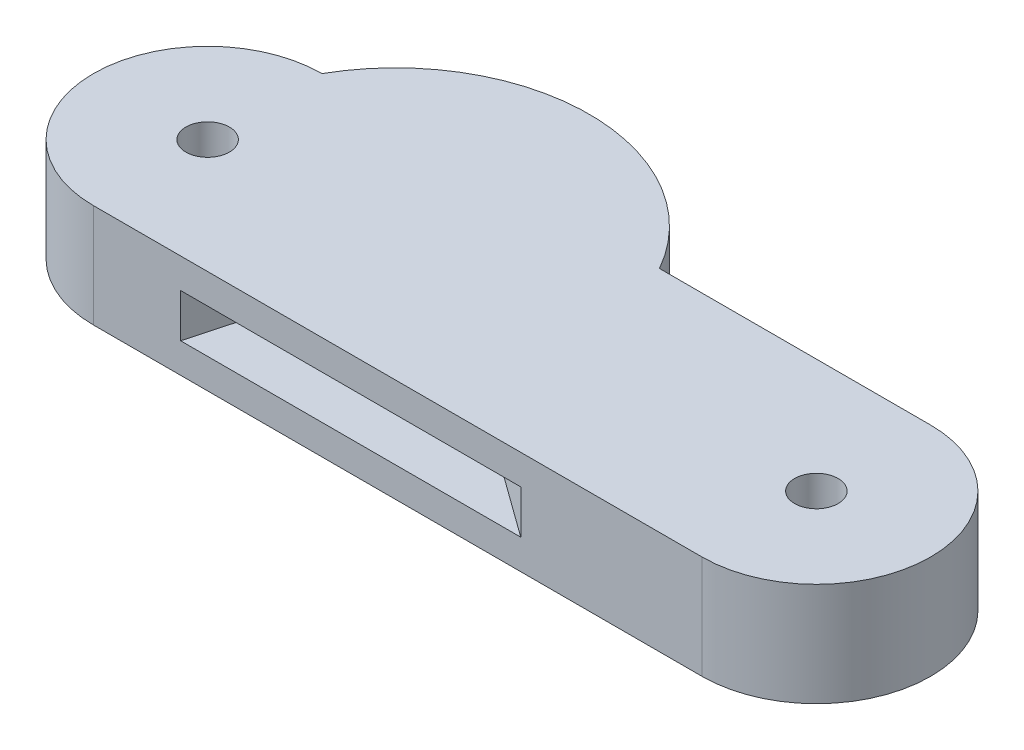
ISO-10303-21;
HEADER;
FILE_DESCRIPTION(('STEP AP214'),'2;1');
FILE_NAME('part.step','',(''),(''),'','','');
FILE_SCHEMA(('AUTOMOTIVE_DESIGN { 1 0 10303 214 1 1 1 1 }'));
ENDSEC;
DATA;
#1=APPLICATION_CONTEXT('core data for automotive mechanical design processes');
#2=APPLICATION_PROTOCOL_DEFINITION('international standard','automotive_design',2000,#1);
#3=PRODUCT_CONTEXT('',#1,'mechanical');
#4=PRODUCT('Part','Part','',(#3));
#5=PRODUCT_RELATED_PRODUCT_CATEGORY('part','',(#4));
#6=PRODUCT_DEFINITION_FORMATION('','',#4);
#7=PRODUCT_DEFINITION_CONTEXT('part definition',#1,'design');
#8=PRODUCT_DEFINITION('design','',#6,#7);
#9=PRODUCT_DEFINITION_SHAPE('','',#8);
#10=(LENGTH_UNIT() NAMED_UNIT(*) SI_UNIT(.MILLI.,.METRE.));
#11=(NAMED_UNIT(*) PLANE_ANGLE_UNIT() SI_UNIT($,.RADIAN.));
#12=(NAMED_UNIT(*) SI_UNIT($,.STERADIAN.) SOLID_ANGLE_UNIT());
#13=UNCERTAINTY_MEASURE_WITH_UNIT(LENGTH_MEASURE(1.E-05),#10,'distance_accuracy_value','');
#14=(GEOMETRIC_REPRESENTATION_CONTEXT(3) GLOBAL_UNCERTAINTY_ASSIGNED_CONTEXT((#13)) GLOBAL_UNIT_ASSIGNED_CONTEXT((#10,
#11,#12)) REPRESENTATION_CONTEXT('',''));
#15=CARTESIAN_POINT('',(0.,0.,0.));
#16=DIRECTION('',(0.,0.,1.));
#17=DIRECTION('',(1.,0.,0.));
#18=AXIS2_PLACEMENT_3D('',#15,#16,#17);
#19=CARTESIAN_POINT('',(-40.4241193156667,37.0570550282,-1.7460511013579));
#20=DIRECTION('',(0.,-1.,0.));
#21=DIRECTION('',(0.,0.,-1.));
#22=AXIS2_PLACEMENT_3D('',#19,#20,#21);
#23=CYLINDRICAL_SURFACE('',#22,17.8069548217708);
#24=CARTESIAN_POINT('',(-40.4241193156667,4.75,-1.7460511013579));
#25=DIRECTION('',(0.,1.,0.));
#26=DIRECTION('',(0.,0.,1.));
#27=AXIS2_PLACEMENT_3D('',#24,#25,#26);
#28=CIRCLE('',#27,17.8069548217708);
#29=CARTESIAN_POINT('',(-24.917700351162,4.75,-10.5003992165423));
#30=VERTEX_POINT('',#29);
#31=CARTESIAN_POINT('',(-55.9305382801715,4.75,-10.5003992165423));
#32=VERTEX_POINT('',#31);
#33=EDGE_CURVE('E151',#30,#32,#28,.T.);
#34=ORIENTED_EDGE('',*,*,#33,.F.);
#35=DIRECTION('',(0.,-1.,0.));
#36=VECTOR('',#35,1.);
#37=CARTESIAN_POINT('',(-24.917700351162,37.0570550282,-10.5003992165423));
#38=LINE('',#37,#36);
#39=CARTESIAN_POINT('',(-24.917700351162,-4.75,-10.5003992165423));
#40=VERTEX_POINT('',#39);
#41=EDGE_CURVE('E150',#30,#40,#38,.T.);
#42=ORIENTED_EDGE('',*,*,#41,.T.);
#43=CARTESIAN_POINT('',(-40.4241193156667,-4.75,-1.7460511013579));
#44=DIRECTION('',(0.,1.,0.));
#45=DIRECTION('',(0.,0.,1.));
#46=AXIS2_PLACEMENT_3D('',#43,#44,#45);
#47=CIRCLE('',#46,17.8069548217708);
#48=CARTESIAN_POINT('',(-55.9305382801715,-4.75,-10.5003992165423));
#49=VERTEX_POINT('',#48);
#50=EDGE_CURVE('E146',#49,#40,#47,.F.);
#51=ORIENTED_EDGE('',*,*,#50,.F.);
#52=DIRECTION('',(0.,-1.,0.));
#53=VECTOR('',#52,1.);
#54=CARTESIAN_POINT('',(-55.9305382801715,4.75,-10.5003992165423));
#55=LINE('',#54,#53);
#56=EDGE_CURVE('E209',#32,#49,#55,.T.);
#57=ORIENTED_EDGE('',*,*,#56,.F.);
#58=EDGE_LOOP('',(#34,#42,#51,#57));
#59=FACE_BOUND('',#58,.T.);
#60=CARTESIAN_POINT('',(-40.4241193156667,-2.,-1.7460511013579));
#61=DIRECTION('',(0.,1.,0.));
#62=DIRECTION('',(0.,0.,1.));
#63=AXIS2_PLACEMENT_3D('',#60,#61,#62);
#64=CIRCLE('',#63,17.8069548217708);
#65=CARTESIAN_POINT('',(-35.7381547906292,-2.,-18.9253810211969));
#66=VERTEX_POINT('',#65);
#67=CARTESIAN_POINT('',(-54.8543825263999,-2.,-12.1794179449777));
#68=VERTEX_POINT('',#67);
#69=EDGE_CURVE('E125',#66,#68,#64,.T.);
#70=ORIENTED_EDGE('',*,*,#69,.F.);
#71=DIRECTION('',(0.,1.,0.));
#72=VECTOR('',#71,1.);
#73=CARTESIAN_POINT('',(-35.7381547906292,-2.,-18.9253810211969));
#74=LINE('',#73,#72);
#75=CARTESIAN_POINT('',(-35.7381547906292,2.,-18.9253810211969));
#76=VERTEX_POINT('',#75);
#77=EDGE_CURVE('E135',#66,#76,#74,.T.);
#78=ORIENTED_EDGE('',*,*,#77,.T.);
#79=CARTESIAN_POINT('',(-40.4241193156667,2.,-1.7460511013579));
#80=DIRECTION('',(0.,1.,0.));
#81=DIRECTION('',(0.,0.,1.));
#82=AXIS2_PLACEMENT_3D('',#79,#80,#81);
#83=CIRCLE('',#82,17.8069548217708);
#84=CARTESIAN_POINT('',(-54.8543825263999,2.,-12.1794179449777));
#85=VERTEX_POINT('',#84);
#86=EDGE_CURVE('E142',#76,#85,#83,.T.);
#87=ORIENTED_EDGE('',*,*,#86,.T.);
#88=DIRECTION('',(0.,1.,0.));
#89=VECTOR('',#88,1.);
#90=CARTESIAN_POINT('',(-54.8543825263999,-2.,-12.1794179449777));
#91=LINE('',#90,#89);
#92=EDGE_CURVE('E140',#68,#85,#91,.T.);
#93=ORIENTED_EDGE('',*,*,#92,.F.);
#94=EDGE_LOOP('',(#70,#78,#87,#93));
#95=FACE_BOUND('',#94,.T.);
#96=ADVANCED_FACE('F39',(#59,#95),#23,.T.);
#97=CARTESIAN_POINT('',(0.,4.75,-10.5003992165423));
#98=DIRECTION('',(0.,0.,1.));
#99=DIRECTION('',(1.,0.,0.));
#100=AXIS2_PLACEMENT_3D('',#97,#98,#99);
#101=PLANE('',#100);
#102=ORIENTED_EDGE('',*,*,#41,.F.);
#103=DIRECTION('',(-1.,0.,0.));
#104=VECTOR('',#103,1.);
#105=CARTESIAN_POINT('',(0.,4.75,-10.5003992165423));
#106=LINE('',#105,#104);
#107=CARTESIAN_POINT('',(0.,4.75,-10.5003992165423));
#108=VERTEX_POINT('',#107);
#109=EDGE_CURVE('E187',#108,#30,#106,.T.);
#110=ORIENTED_EDGE('',*,*,#109,.F.);
#111=DIRECTION('',(0.,-1.,0.));
#112=VECTOR('',#111,1.);
#113=CARTESIAN_POINT('',(0.,4.75,-10.5003992165423));
#114=LINE('',#113,#112);
#115=CARTESIAN_POINT('',(0.,-4.75,-10.5003992165423));
#116=VERTEX_POINT('',#115);
#117=EDGE_CURVE('E212',#108,#116,#114,.T.);
#118=ORIENTED_EDGE('',*,*,#117,.T.);
#119=DIRECTION('',(-1.,0.,0.));
#120=VECTOR('',#119,1.);
#121=CARTESIAN_POINT('',(0.,-4.75,-10.5003992165423));
#122=LINE('',#121,#120);
#123=EDGE_CURVE('E198',#116,#40,#122,.T.);
#124=ORIENTED_EDGE('',*,*,#123,.T.);
#125=EDGE_LOOP('',(#102,#110,#118,#124));
#126=FACE_BOUND('',#125,.T.);
#127=ADVANCED_FACE('F236',(#126),#101,.F.);
#128=CARTESIAN_POINT('',(0.,4.75,10.5003992165423));
#129=DIRECTION('',(0.,0.,-1.));
#130=DIRECTION('',(-1.,0.,0.));
#131=AXIS2_PLACEMENT_3D('',#128,#129,#130);
#132=PLANE('',#131);
#133=DIRECTION('',(1.,0.,0.));
#134=VECTOR('',#133,1.);
#135=CARTESIAN_POINT('',(0.,-4.75,10.5003992165423));
#136=LINE('',#135,#134);
#137=CARTESIAN_POINT('',(-55.9305382801715,-4.75,10.5003992165423));
#138=VERTEX_POINT('',#137);
#139=CARTESIAN_POINT('',(0.,-4.75,10.5003992165423));
#140=VERTEX_POINT('',#139);
#141=EDGE_CURVE('E188',#138,#140,#136,.T.);
#142=ORIENTED_EDGE('',*,*,#141,.T.);
#143=DIRECTION('',(0.,-1.,0.));
#144=VECTOR('',#143,1.);
#145=CARTESIAN_POINT('',(0.,4.75,10.5003992165423));
#146=LINE('',#145,#144);
#147=CARTESIAN_POINT('',(0.,4.75,10.5003992165423));
#148=VERTEX_POINT('',#147);
#149=EDGE_CURVE('E195',#148,#140,#146,.T.);
#150=ORIENTED_EDGE('',*,*,#149,.F.);
#151=DIRECTION('',(1.,0.,0.));
#152=VECTOR('',#151,1.);
#153=CARTESIAN_POINT('',(0.,4.75,10.5003992165423));
#154=LINE('',#153,#152);
#155=CARTESIAN_POINT('',(-55.9305382801715,4.75,10.5003992165423));
#156=VERTEX_POINT('',#155);
#157=EDGE_CURVE('E193',#156,#148,#154,.T.);
#158=ORIENTED_EDGE('',*,*,#157,.F.);
#159=DIRECTION('',(0.,-1.,0.));
#160=VECTOR('',#159,1.);
#161=CARTESIAN_POINT('',(-55.9305382801715,4.75,10.5003992165423));
#162=LINE('',#161,#160);
#163=EDGE_CURVE('E206',#156,#138,#162,.T.);
#164=ORIENTED_EDGE('',*,*,#163,.T.);
#165=EDGE_LOOP('',(#142,#150,#158,#164));
#166=FACE_BOUND('',#165,.T.);
#167=DIRECTION('',(1.,0.,0.));
#168=VECTOR('',#167,1.);
#169=CARTESIAN_POINT('',(0.,-2.,10.5003992165423));
#170=LINE('',#169,#168);
#171=CARTESIAN_POINT('',(-47.9106890267398,-2.,10.5003992165423));
#172=VERTEX_POINT('',#171);
#173=CARTESIAN_POINT('',(-16.659276720951,-2.,10.5003992165423));
#174=VERTEX_POINT('',#173);
#175=EDGE_CURVE('E11',#172,#174,#170,.T.);
#176=ORIENTED_EDGE('',*,*,#175,.F.);
#177=DIRECTION('',(0.,1.,0.));
#178=VECTOR('',#177,1.);
#179=CARTESIAN_POINT('',(-47.9106890267398,4.75,10.5003992165423));
#180=LINE('',#179,#178);
#181=CARTESIAN_POINT('',(-47.9106890267398,2.,10.5003992165423));
#182=VERTEX_POINT('',#181);
#183=EDGE_CURVE('E218',#172,#182,#180,.T.);
#184=ORIENTED_EDGE('',*,*,#183,.T.);
#185=DIRECTION('',(1.,0.,0.));
#186=VECTOR('',#185,1.);
#187=CARTESIAN_POINT('',(0.,2.,10.5003992165423));
#188=LINE('',#187,#186);
#189=CARTESIAN_POINT('',(-16.659276720951,2.,10.5003992165423));
#190=VERTEX_POINT('',#189);
#191=EDGE_CURVE('E215',#182,#190,#188,.T.);
#192=ORIENTED_EDGE('',*,*,#191,.T.);
#193=DIRECTION('',(0.,-1.,0.));
#194=VECTOR('',#193,1.);
#195=CARTESIAN_POINT('',(-16.659276720951,4.75,10.5003992165423));
#196=LINE('',#195,#194);
#197=EDGE_CURVE('E47',#190,#174,#196,.T.);
#198=ORIENTED_EDGE('',*,*,#197,.T.);
#199=EDGE_LOOP('',(#176,#184,#192,#198));
#200=FACE_BOUND('',#199,.T.);
#201=ADVANCED_FACE('F223',(#166,#200),#132,.F.);
#202=CARTESIAN_POINT('',(0.,4.75,0.));
#203=DIRECTION('',(0.,1.,0.));
#204=DIRECTION('',(0.,0.,1.));
#205=AXIS2_PLACEMENT_3D('',#202,#203,#204);
#206=PLANE('',#205);
#207=CARTESIAN_POINT('',(0.,4.75,0.));
#208=DIRECTION('',(0.,1.,0.));
#209=DIRECTION('',(0.,0.,1.));
#210=AXIS2_PLACEMENT_3D('',#207,#208,#209);
#211=CIRCLE('',#210,2.);
#212=CARTESIAN_POINT('',(0.,4.75,2.));
#213=VERTEX_POINT('',#212);
#214=EDGE_CURVE('E178',#213,#213,#211,.T.);
#215=ORIENTED_EDGE('',*,*,#214,.F.);
#216=EDGE_LOOP('',(#215));
#217=FACE_BOUND('',#216,.T.);
#218=CARTESIAN_POINT('',(0.,4.75,0.));
#219=DIRECTION('',(0.,1.,0.));
#220=DIRECTION('',(0.,0.,1.));
#221=AXIS2_PLACEMENT_3D('',#218,#219,#220);
#222=CIRCLE('',#221,10.5003992165423);
#223=EDGE_CURVE('E184',#148,#108,#222,.T.);
#224=ORIENTED_EDGE('',*,*,#223,.T.);
#225=ORIENTED_EDGE('',*,*,#109,.T.);
#226=ORIENTED_EDGE('',*,*,#33,.T.);
#227=CARTESIAN_POINT('',(-55.9305382801715,4.75,0.));
#228=DIRECTION('',(0.,1.,0.));
#229=DIRECTION('',(0.,0.,1.));
#230=AXIS2_PLACEMENT_3D('',#227,#228,#229);
#231=CIRCLE('',#230,10.5003992165423);
#232=EDGE_CURVE('E191',#32,#156,#231,.T.);
#233=ORIENTED_EDGE('',*,*,#232,.T.);
#234=ORIENTED_EDGE('',*,*,#157,.T.);
#235=EDGE_LOOP('',(#224,#225,#226,#233,#234));
#236=FACE_BOUND('',#235,.T.);
#237=CARTESIAN_POINT('',(-55.9305382801715,4.75,0.));
#238=DIRECTION('',(0.,1.,0.));
#239=DIRECTION('',(0.,0.,1.));
#240=AXIS2_PLACEMENT_3D('',#237,#238,#239);
#241=CIRCLE('',#240,2.);
#242=CARTESIAN_POINT('',(-55.9305382801715,4.75,2.));
#243=VERTEX_POINT('',#242);
#244=EDGE_CURVE('E172',#243,#243,#241,.T.);
#245=ORIENTED_EDGE('',*,*,#244,.F.);
#246=EDGE_LOOP('',(#245));
#247=FACE_BOUND('',#246,.T.);
#248=ADVANCED_FACE('F246',(#217,#236,#247),#206,.T.);
#249=CARTESIAN_POINT('',(0.,-4.75,0.));
#250=DIRECTION('',(0.,1.,0.));
#251=DIRECTION('',(0.,0.,1.));
#252=AXIS2_PLACEMENT_3D('',#249,#250,#251);
#253=PLANE('',#252);
#254=CARTESIAN_POINT('',(0.,-4.75,0.));
#255=DIRECTION('',(0.,1.,0.));
#256=DIRECTION('',(0.,0.,1.));
#257=AXIS2_PLACEMENT_3D('',#254,#255,#256);
#258=CIRCLE('',#257,10.5003992165423);
#259=EDGE_CURVE('E181',#140,#116,#258,.T.);
#260=ORIENTED_EDGE('',*,*,#259,.F.);
#261=ORIENTED_EDGE('',*,*,#141,.F.);
#262=CARTESIAN_POINT('',(-55.9305382801715,-4.75,0.));
#263=DIRECTION('',(0.,1.,0.));
#264=DIRECTION('',(0.,0.,1.));
#265=AXIS2_PLACEMENT_3D('',#262,#263,#264);
#266=CIRCLE('',#265,10.5003992165423);
#267=EDGE_CURVE('E201',#49,#138,#266,.T.);
#268=ORIENTED_EDGE('',*,*,#267,.F.);
#269=ORIENTED_EDGE('',*,*,#50,.T.);
#270=ORIENTED_EDGE('',*,*,#123,.F.);
#271=EDGE_LOOP('',(#260,#261,#268,#269,#270));
#272=FACE_BOUND('',#271,.T.);
#273=CARTESIAN_POINT('',(0.,-4.75,0.));
#274=DIRECTION('',(0.,1.,0.));
#275=DIRECTION('',(0.,0.,1.));
#276=AXIS2_PLACEMENT_3D('',#273,#274,#275);
#277=CIRCLE('',#276,2.);
#278=CARTESIAN_POINT('',(0.,-4.75,2.));
#279=VERTEX_POINT('',#278);
#280=EDGE_CURVE('E175',#279,#279,#277,.T.);
#281=ORIENTED_EDGE('',*,*,#280,.T.);
#282=EDGE_LOOP('',(#281));
#283=FACE_BOUND('',#282,.T.);
#284=CARTESIAN_POINT('',(-55.9305382801715,-4.75,0.));
#285=DIRECTION('',(0.,1.,0.));
#286=DIRECTION('',(0.,0.,1.));
#287=AXIS2_PLACEMENT_3D('',#284,#285,#286);
#288=CIRCLE('',#287,2.);
#289=CARTESIAN_POINT('',(-55.9305382801715,-4.75,2.));
#290=VERTEX_POINT('',#289);
#291=EDGE_CURVE('E170',#290,#290,#288,.T.);
#292=ORIENTED_EDGE('',*,*,#291,.T.);
#293=EDGE_LOOP('',(#292));
#294=FACE_BOUND('',#293,.T.);
#295=ADVANCED_FACE('F256',(#272,#283,#294),#253,.F.);
#296=CARTESIAN_POINT('',(0.,4.75,0.));
#297=DIRECTION('',(0.,-1.,0.));
#298=DIRECTION('',(0.,0.,-1.));
#299=AXIS2_PLACEMENT_3D('',#296,#297,#298);
#300=CYLINDRICAL_SURFACE('',#299,10.5003992165423);
#301=ORIENTED_EDGE('',*,*,#259,.T.);
#302=ORIENTED_EDGE('',*,*,#117,.F.);
#303=ORIENTED_EDGE('',*,*,#223,.F.);
#304=ORIENTED_EDGE('',*,*,#149,.T.);
#305=EDGE_LOOP('',(#301,#302,#303,#304));
#306=FACE_BOUND('',#305,.T.);
#307=ADVANCED_FACE('F41',(#306),#300,.T.);
#308=CARTESIAN_POINT('',(-55.9305382801715,4.75,0.));
#309=DIRECTION('',(0.,-1.,0.));
#310=DIRECTION('',(0.,0.,-1.));
#311=AXIS2_PLACEMENT_3D('',#308,#309,#310);
#312=CYLINDRICAL_SURFACE('',#311,10.5003992165423);
#313=ORIENTED_EDGE('',*,*,#267,.T.);
#314=ORIENTED_EDGE('',*,*,#163,.F.);
#315=ORIENTED_EDGE('',*,*,#232,.F.);
#316=ORIENTED_EDGE('',*,*,#56,.T.);
#317=EDGE_LOOP('',(#313,#314,#315,#316));
#318=FACE_BOUND('',#317,.T.);
#319=ADVANCED_FACE('F260',(#318),#312,.T.);
#320=CARTESIAN_POINT('',(0.,4.75,0.));
#321=DIRECTION('',(0.,-1.,0.));
#322=DIRECTION('',(0.,0.,-1.));
#323=AXIS2_PLACEMENT_3D('',#320,#321,#322);
#324=CYLINDRICAL_SURFACE('',#323,2.);
#325=ORIENTED_EDGE('',*,*,#214,.T.);
#326=EDGE_LOOP('',(#325));
#327=FACE_BOUND('',#326,.T.);
#328=ORIENTED_EDGE('',*,*,#280,.F.);
#329=EDGE_LOOP('',(#328));
#330=FACE_BOUND('',#329,.T.);
#331=ADVANCED_FACE('F273',(#327,#330),#324,.F.);
#332=CARTESIAN_POINT('',(-55.9305382801715,4.75,0.));
#333=DIRECTION('',(0.,-1.,0.));
#334=DIRECTION('',(0.,0.,-1.));
#335=AXIS2_PLACEMENT_3D('',#332,#333,#334);
#336=CYLINDRICAL_SURFACE('',#335,2.);
#337=ORIENTED_EDGE('',*,*,#244,.T.);
#338=EDGE_LOOP('',(#337));
#339=FACE_BOUND('',#338,.T.);
#340=ORIENTED_EDGE('',*,*,#291,.F.);
#341=EDGE_LOOP('',(#340));
#342=FACE_BOUND('',#341,.T.);
#343=ADVANCED_FACE('F278',(#339,#342),#336,.F.);
#344=CARTESIAN_POINT('',(-43.8872651072943,-2.,-4.24997427651618));
#345=DIRECTION('',(-0.585915275691269,0.,0.810372315489383));
#346=DIRECTION('',(0.810372315489383,0.,0.585915275691269));
#347=AXIS2_PLACEMENT_3D('',#344,#345,#346);
#348=PLANE('',#347);
#349=DIRECTION('',(0.810372315489383,0.,0.585915275691269));
#350=VECTOR('',#349,1.);
#351=CARTESIAN_POINT('',(-43.8872651072943,2.,-4.24997427651618));
#352=LINE('',#351,#350);
#353=CARTESIAN_POINT('',(-43.8872651072943,2.,-4.24997427651618));
#354=VERTEX_POINT('',#353);
#355=EDGE_CURVE('E54',#85,#354,#352,.T.);
#356=ORIENTED_EDGE('',*,*,#355,.T.);
#357=DIRECTION('',(0.,1.,0.));
#358=VECTOR('',#357,1.);
#359=CARTESIAN_POINT('',(-43.8872651072943,-2.,-4.24997427651618));
#360=LINE('',#359,#358);
#361=CARTESIAN_POINT('',(-43.8872651072943,-2.,-4.24997427651618));
#362=VERTEX_POINT('',#361);
#363=EDGE_CURVE('E167',#362,#354,#360,.T.);
#364=ORIENTED_EDGE('',*,*,#363,.F.);
#365=DIRECTION('',(0.810372315489383,0.,0.585915275691269));
#366=VECTOR('',#365,1.);
#367=CARTESIAN_POINT('',(-43.8872651072943,-2.,-4.24997427651618));
#368=LINE('',#367,#366);
#369=EDGE_CURVE('E132',#68,#362,#368,.T.);
#370=ORIENTED_EDGE('',*,*,#369,.F.);
#371=ORIENTED_EDGE('',*,*,#92,.T.);
#372=EDGE_LOOP('',(#356,#364,#370,#371));
#373=FACE_BOUND('',#372,.T.);
#374=ADVANCED_FACE('F331',(#373),#348,.F.);
#375=CARTESIAN_POINT('',(-35.7518279113757,-2.,-18.8752536565782));
#376=DIRECTION('',(0.964753945398658,0.,0.263153614525288));
#377=DIRECTION('',(0.263153614525288,0.,-0.964753945398658));
#378=AXIS2_PLACEMENT_3D('',#375,#376,#377);
#379=PLANE('',#378);
#380=DIRECTION('',(0.263153614525288,0.,-0.964753945398658));
#381=VECTOR('',#380,1.);
#382=CARTESIAN_POINT('',(-35.7518279113757,-2.,-18.8752536565782));
#383=LINE('',#382,#381);
#384=CARTESIAN_POINT('',(-39.2995259463282,-2.,-5.86895054165502));
#385=VERTEX_POINT('',#384);
#386=EDGE_CURVE('E121',#385,#66,#383,.T.);
#387=ORIENTED_EDGE('',*,*,#386,.F.);
#388=DIRECTION('',(0.,1.,0.));
#389=VECTOR('',#388,1.);
#390=CARTESIAN_POINT('',(-39.2995259463282,-2.,-5.86895054165502));
#391=LINE('',#390,#389);
#392=CARTESIAN_POINT('',(-39.2995259463282,2.,-5.86895054165502));
#393=VERTEX_POINT('',#392);
#394=EDGE_CURVE('E161',#385,#393,#391,.T.);
#395=ORIENTED_EDGE('',*,*,#394,.T.);
#396=DIRECTION('',(0.263153614525288,0.,-0.964753945398658));
#397=VECTOR('',#396,1.);
#398=CARTESIAN_POINT('',(-35.7518279113757,2.,-18.8752536565782));
#399=LINE('',#398,#397);
#400=EDGE_CURVE('E137',#393,#76,#399,.T.);
#401=ORIENTED_EDGE('',*,*,#400,.T.);
#402=ORIENTED_EDGE('',*,*,#77,.F.);
#403=EDGE_LOOP('',(#387,#395,#401,#402));
#404=FACE_BOUND('',#403,.T.);
#405=ADVANCED_FACE('F136',(#404),#379,.F.);
#406=CARTESIAN_POINT('',(26.6452391554762,-2.,41.8104240945407));
#407=DIRECTION('',(0.585915275691269,0.,-0.810372315489383));
#408=DIRECTION('',(-0.810372315489383,0.,-0.585915275691269));
#409=AXIS2_PLACEMENT_3D('',#406,#407,#408);
#410=PLANE('',#409);
#411=DIRECTION('',(-0.810372315489383,0.,-0.585915275691269));
#412=VECTOR('',#411,1.);
#413=CARTESIAN_POINT('',(26.6452391554762,2.,41.8104240945407));
#414=LINE('',#413,#412);
#415=EDGE_CURVE('E61',#190,#393,#414,.T.);
#416=ORIENTED_EDGE('',*,*,#415,.T.);
#417=ORIENTED_EDGE('',*,*,#394,.F.);
#418=DIRECTION('',(-0.810372315489383,0.,-0.585915275691269));
#419=VECTOR('',#418,1.);
#420=CARTESIAN_POINT('',(26.6452391554762,-2.,41.8104240945407));
#421=LINE('',#420,#419);
#422=EDGE_CURVE('E128',#174,#385,#421,.T.);
#423=ORIENTED_EDGE('',*,*,#422,.F.);
#424=ORIENTED_EDGE('',*,*,#197,.F.);
#425=EDGE_LOOP('',(#416,#417,#423,#424));
#426=FACE_BOUND('',#425,.T.);
#427=ADVANCED_FACE('F225',(#426),#410,.F.);
#428=CARTESIAN_POINT('',(-43.8872651072943,-2.,-4.24997427651618));
#429=DIRECTION('',(-0.964753945398657,0.,-0.263153614525289));
#430=DIRECTION('',(-0.263153614525289,0.,0.964753945398657));
#431=AXIS2_PLACEMENT_3D('',#428,#429,#430);
#432=PLANE('',#431);
#433=DIRECTION('',(-0.263153614525289,0.,0.964753945398657));
#434=VECTOR('',#433,1.);
#435=CARTESIAN_POINT('',(-43.8872651072943,-2.,-4.24997427651618));
#436=LINE('',#435,#434);
#437=EDGE_CURVE('E158',#362,#172,#436,.T.);
#438=ORIENTED_EDGE('',*,*,#437,.F.);
#439=ORIENTED_EDGE('',*,*,#363,.T.);
#440=DIRECTION('',(-0.263153614525289,0.,0.964753945398657));
#441=VECTOR('',#440,1.);
#442=CARTESIAN_POINT('',(-43.8872651072943,2.,-4.24997427651618));
#443=LINE('',#442,#441);
#444=EDGE_CURVE('E155',#354,#182,#443,.T.);
#445=ORIENTED_EDGE('',*,*,#444,.T.);
#446=ORIENTED_EDGE('',*,*,#183,.F.);
#447=EDGE_LOOP('',(#438,#439,#445,#446));
#448=FACE_BOUND('',#447,.T.);
#449=ADVANCED_FACE('F232',(#448),#432,.F.);
#450=CARTESIAN_POINT('',(-41.5933955268113,-2.,-5.05946240908561));
#451=DIRECTION('',(0.,1.,0.));
#452=DIRECTION('',(0.,0.,1.));
#453=AXIS2_PLACEMENT_3D('',#450,#451,#452);
#454=PLANE('',#453);
#455=ORIENTED_EDGE('',*,*,#386,.T.);
#456=ORIENTED_EDGE('',*,*,#69,.T.);
#457=ORIENTED_EDGE('',*,*,#369,.T.);
#458=ORIENTED_EDGE('',*,*,#437,.T.);
#459=ORIENTED_EDGE('',*,*,#175,.T.);
#460=ORIENTED_EDGE('',*,*,#422,.T.);
#461=EDGE_LOOP('',(#455,#456,#457,#458,#459,#460));
#462=FACE_BOUND('',#461,.T.);
#463=ADVANCED_FACE('F123',(#462),#454,.T.);
#464=CARTESIAN_POINT('',(-41.5933955268113,2.,-5.05946240908561));
#465=DIRECTION('',(0.,1.,0.));
#466=DIRECTION('',(0.,0.,1.));
#467=AXIS2_PLACEMENT_3D('',#464,#465,#466);
#468=PLANE('',#467);
#469=ORIENTED_EDGE('',*,*,#400,.F.);
#470=ORIENTED_EDGE('',*,*,#415,.F.);
#471=ORIENTED_EDGE('',*,*,#191,.F.);
#472=ORIENTED_EDGE('',*,*,#444,.F.);
#473=ORIENTED_EDGE('',*,*,#355,.F.);
#474=ORIENTED_EDGE('',*,*,#86,.F.);
#475=EDGE_LOOP('',(#469,#470,#471,#472,#473,#474));
#476=FACE_BOUND('',#475,.T.);
#477=ADVANCED_FACE('F226',(#476),#468,.F.);
#478=CLOSED_SHELL('',(#96,#127,#201,#248,#295,#307,#319,#331,#343,#374,#405,#427,#449,#463,#477));
#479=MANIFOLD_SOLID_BREP('B2',#478);
#480=ADVANCED_BREP_SHAPE_REPRESENTATION('',(#18,#479),#14);
#481=SHAPE_DEFINITION_REPRESENTATION(#9,#480);
ENDSEC;
END-ISO-10303-21;
